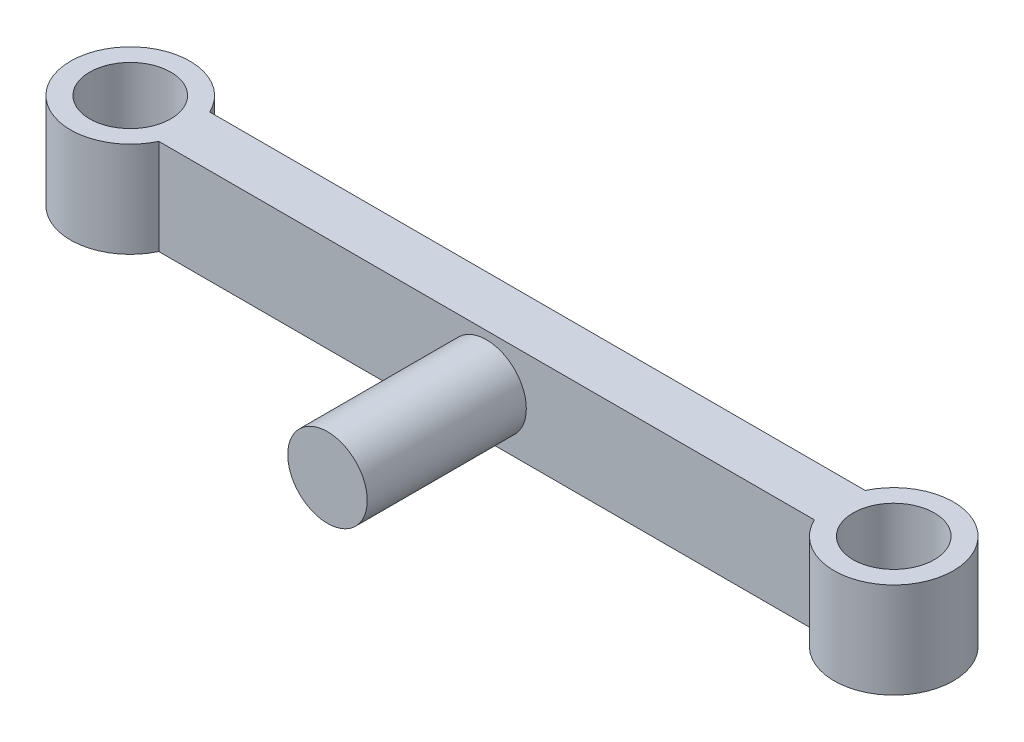
ISO-10303-21;
HEADER;
FILE_DESCRIPTION(('STEP AP214'),'2;1');
FILE_NAME('part.step','',(''),(''),'','','');
FILE_SCHEMA(('AUTOMOTIVE_DESIGN { 1 0 10303 214 1 1 1 1 }'));
ENDSEC;
DATA;
#1=APPLICATION_CONTEXT('core data for automotive mechanical design processes');
#2=APPLICATION_PROTOCOL_DEFINITION('international standard','automotive_design',2000,#1);
#3=PRODUCT_CONTEXT('',#1,'mechanical');
#4=PRODUCT('Part','Part','',(#3));
#5=PRODUCT_RELATED_PRODUCT_CATEGORY('part','',(#4));
#6=PRODUCT_DEFINITION_FORMATION('','',#4);
#7=PRODUCT_DEFINITION_CONTEXT('part definition',#1,'design');
#8=PRODUCT_DEFINITION('design','',#6,#7);
#9=PRODUCT_DEFINITION_SHAPE('','',#8);
#10=(LENGTH_UNIT() NAMED_UNIT(*) SI_UNIT(.MILLI.,.METRE.));
#11=(NAMED_UNIT(*) PLANE_ANGLE_UNIT() SI_UNIT($,.RADIAN.));
#12=(NAMED_UNIT(*) SI_UNIT($,.STERADIAN.) SOLID_ANGLE_UNIT());
#13=UNCERTAINTY_MEASURE_WITH_UNIT(LENGTH_MEASURE(1.E-05),#10,'distance_accuracy_value','');
#14=(GEOMETRIC_REPRESENTATION_CONTEXT(3) GLOBAL_UNCERTAINTY_ASSIGNED_CONTEXT((#13)) GLOBAL_UNIT_ASSIGNED_CONTEXT((#10,
#11,#12)) REPRESENTATION_CONTEXT('',''));
#15=CARTESIAN_POINT('',(0.,0.,0.));
#16=DIRECTION('',(0.,0.,1.));
#17=DIRECTION('',(1.,0.,0.));
#18=AXIS2_PLACEMENT_3D('',#15,#16,#17);
#19=CARTESIAN_POINT('',(0.,0.,29.));
#20=DIRECTION('',(0.,0.,-1.));
#21=DIRECTION('',(-1.,0.,0.));
#22=AXIS2_PLACEMENT_3D('',#19,#20,#21);
#23=CYLINDRICAL_SURFACE('',#22,6.25);
#24=CARTESIAN_POINT('',(0.,0.,4.));
#25=DIRECTION('',(0.,0.,1.));
#26=DIRECTION('',(1.,0.,0.));
#27=AXIS2_PLACEMENT_3D('',#24,#25,#26);
#28=CIRCLE('',#27,6.25);
#29=CARTESIAN_POINT('',(6.25,0.,4.));
#30=VERTEX_POINT('',#29);
#31=EDGE_CURVE('E89',#30,#30,#28,.T.);
#32=ORIENTED_EDGE('',*,*,#31,.T.);
#33=EDGE_LOOP('',(#32));
#34=FACE_BOUND('',#33,.T.);
#35=CARTESIAN_POINT('',(0.,0.,29.));
#36=DIRECTION('',(0.,0.,1.));
#37=DIRECTION('',(1.,0.,0.));
#38=AXIS2_PLACEMENT_3D('',#35,#36,#37);
#39=CIRCLE('',#38,6.25);
#40=CARTESIAN_POINT('',(6.25,0.,29.));
#41=VERTEX_POINT('',#40);
#42=EDGE_CURVE('E107',#41,#41,#39,.T.);
#43=ORIENTED_EDGE('',*,*,#42,.F.);
#44=EDGE_LOOP('',(#43));
#45=FACE_BOUND('',#44,.T.);
#46=DIRECTION('',(0.,0.,-1.));
#47=VECTOR('',#46,1.);
#48=CARTESIAN_POINT('',(-4.33733789322437,-4.5,29.));
#49=LINE('',#48,#47);
#50=CARTESIAN_POINT('',(-4.33733789322437,-4.5,26.));
#51=VERTEX_POINT('',#50);
#52=CARTESIAN_POINT('',(-4.33733789322437,-4.5,18.));
#53=VERTEX_POINT('',#52);
#54=EDGE_CURVE('E94',#51,#53,#49,.T.);
#55=ORIENTED_EDGE('',*,*,#54,.F.);
#56=CARTESIAN_POINT('',(0.,0.,26.));
#57=DIRECTION('',(0.,0.,-1.));
#58=DIRECTION('',(0.,1.,0.));
#59=AXIS2_PLACEMENT_3D('',#56,#57,#58);
#60=CIRCLE('',#59,6.25);
#61=CARTESIAN_POINT('',(4.33733789322437,-4.5,26.));
#62=VERTEX_POINT('',#61);
#63=EDGE_CURVE('E101',#51,#62,#60,.F.);
#64=ORIENTED_EDGE('',*,*,#63,.T.);
#65=DIRECTION('',(0.,0.,-1.));
#66=VECTOR('',#65,1.);
#67=CARTESIAN_POINT('',(4.33733789322437,-4.5,29.));
#68=LINE('',#67,#66);
#69=CARTESIAN_POINT('',(4.33733789322437,-4.5,18.));
#70=VERTEX_POINT('',#69);
#71=EDGE_CURVE('E100',#62,#70,#68,.T.);
#72=ORIENTED_EDGE('',*,*,#71,.T.);
#73=CARTESIAN_POINT('',(0.,0.,18.));
#74=DIRECTION('',(0.,0.,1.));
#75=DIRECTION('',(0.,-1.,0.));
#76=AXIS2_PLACEMENT_3D('',#73,#74,#75);
#77=CIRCLE('',#76,6.25);
#78=EDGE_CURVE('E87',#70,#53,#77,.F.);
#79=ORIENTED_EDGE('',*,*,#78,.T.);
#80=EDGE_LOOP('',(#55,#64,#72,#79));
#81=FACE_BOUND('',#80,.T.);
#82=ADVANCED_FACE('F33',(#34,#45,#81),#23,.T.);
#83=CARTESIAN_POINT('',(-60.,7.5,0.));
#84=DIRECTION('',(0.,-1.,0.));
#85=DIRECTION('',(0.,0.,-1.));
#86=AXIS2_PLACEMENT_3D('',#83,#84,#85);
#87=PLANE('',#86);
#88=CARTESIAN_POINT('',(-60.,7.5,0.));
#89=DIRECTION('',(0.,1.,0.));
#90=DIRECTION('',(0.,0.,-1.));
#91=AXIS2_PLACEMENT_3D('',#88,#89,#90);
#92=CIRCLE('',#91,9.375);
#93=CARTESIAN_POINT('',(-51.5211660589442,7.5,-4.));
#94=VERTEX_POINT('',#93);
#95=CARTESIAN_POINT('',(-51.5211660589442,7.5,4.));
#96=VERTEX_POINT('',#95);
#97=EDGE_CURVE('E11',#94,#96,#92,.T.);
#98=ORIENTED_EDGE('',*,*,#97,.T.);
#99=DIRECTION('',(1.,0.,0.));
#100=VECTOR('',#99,1.);
#101=CARTESIAN_POINT('',(-500000.,7.5,4.));
#102=LINE('',#101,#100);
#103=CARTESIAN_POINT('',(51.5211660589442,7.5,4.));
#104=VERTEX_POINT('',#103);
#105=EDGE_CURVE('E132',#96,#104,#102,.T.);
#106=ORIENTED_EDGE('',*,*,#105,.T.);
#107=CARTESIAN_POINT('',(60.,7.5,0.));
#108=DIRECTION('',(0.,1.,0.));
#109=DIRECTION('',(0.,0.,1.));
#110=AXIS2_PLACEMENT_3D('',#107,#108,#109);
#111=CIRCLE('',#110,9.375);
#112=CARTESIAN_POINT('',(51.5211660589535,7.5,-4.00000000001977));
#113=VERTEX_POINT('',#112);
#114=EDGE_CURVE('E119',#104,#113,#111,.T.);
#115=ORIENTED_EDGE('',*,*,#114,.T.);
#116=DIRECTION('',(1.,0.,0.));
#117=VECTOR('',#116,1.);
#118=CARTESIAN_POINT('',(-500000.,7.5,-4.));
#119=LINE('',#118,#117);
#120=EDGE_CURVE('E55',#94,#113,#119,.T.);
#121=ORIENTED_EDGE('',*,*,#120,.F.);
#122=EDGE_LOOP('',(#98,#106,#115,#121));
#123=FACE_BOUND('',#122,.T.);
#124=CARTESIAN_POINT('',(-60.,7.5,0.));
#125=DIRECTION('',(0.,1.,0.));
#126=DIRECTION('',(0.,0.,-1.));
#127=AXIS2_PLACEMENT_3D('',#124,#125,#126);
#128=CIRCLE('',#127,6.375);
#129=CARTESIAN_POINT('',(-60.,7.5,-6.375));
#130=VERTEX_POINT('',#129);
#131=EDGE_CURVE('E142',#130,#130,#128,.T.);
#132=ORIENTED_EDGE('',*,*,#131,.F.);
#133=EDGE_LOOP('',(#132));
#134=FACE_BOUND('',#133,.T.);
#135=CARTESIAN_POINT('',(60.,7.5,0.));
#136=DIRECTION('',(0.,1.,0.));
#137=DIRECTION('',(0.,0.,1.));
#138=AXIS2_PLACEMENT_3D('',#135,#136,#137);
#139=CIRCLE('',#138,6.37500000000001);
#140=CARTESIAN_POINT('',(60.,7.5,6.37500000000001));
#141=VERTEX_POINT('',#140);
#142=EDGE_CURVE('E113',#141,#141,#139,.T.);
#143=ORIENTED_EDGE('',*,*,#142,.F.);
#144=EDGE_LOOP('',(#143));
#145=FACE_BOUND('',#144,.T.);
#146=ADVANCED_FACE('F170',(#123,#134,#145),#87,.F.);
#147=CARTESIAN_POINT('',(-60.,-7.5,0.));
#148=DIRECTION('',(0.,-1.,0.));
#149=DIRECTION('',(0.,0.,-1.));
#150=AXIS2_PLACEMENT_3D('',#147,#148,#149);
#151=PLANE('',#150);
#152=CARTESIAN_POINT('',(-60.,-7.5,0.));
#153=DIRECTION('',(0.,1.,0.));
#154=DIRECTION('',(0.,0.,-1.));
#155=AXIS2_PLACEMENT_3D('',#152,#153,#154);
#156=CIRCLE('',#155,9.375);
#157=CARTESIAN_POINT('',(-51.5211660590467,-7.5,-4.));
#158=VERTEX_POINT('',#157);
#159=CARTESIAN_POINT('',(-51.5211660589442,-7.5,3.99999999999999));
#160=VERTEX_POINT('',#159);
#161=EDGE_CURVE('E37',#158,#160,#156,.T.);
#162=ORIENTED_EDGE('',*,*,#161,.F.);
#163=DIRECTION('',(1.,0.,0.));
#164=VECTOR('',#163,1.);
#165=CARTESIAN_POINT('',(-500000.,-7.5,-4.));
#166=LINE('',#165,#164);
#167=CARTESIAN_POINT('',(51.5211660589628,-7.5,-4.00000000003955));
#168=VERTEX_POINT('',#167);
#169=EDGE_CURVE('E137',#158,#168,#166,.T.);
#170=ORIENTED_EDGE('',*,*,#169,.T.);
#171=CARTESIAN_POINT('',(60.,-7.5,0.));
#172=DIRECTION('',(0.,1.,0.));
#173=DIRECTION('',(0.,0.,1.));
#174=AXIS2_PLACEMENT_3D('',#171,#172,#173);
#175=CIRCLE('',#174,9.375);
#176=CARTESIAN_POINT('',(51.5211660589442,-7.5,3.99999999999999));
#177=VERTEX_POINT('',#176);
#178=EDGE_CURVE('E116',#177,#168,#175,.T.);
#179=ORIENTED_EDGE('',*,*,#178,.F.);
#180=DIRECTION('',(1.,0.,0.));
#181=VECTOR('',#180,1.);
#182=CARTESIAN_POINT('',(-500000.,-7.5,4.));
#183=LINE('',#182,#181);
#184=EDGE_CURVE('E130',#160,#177,#183,.T.);
#185=ORIENTED_EDGE('',*,*,#184,.F.);
#186=EDGE_LOOP('',(#162,#170,#179,#185));
#187=FACE_BOUND('',#186,.T.);
#188=CARTESIAN_POINT('',(-60.,-7.5,0.));
#189=DIRECTION('',(0.,1.,0.));
#190=DIRECTION('',(0.,0.,-1.));
#191=AXIS2_PLACEMENT_3D('',#188,#189,#190);
#192=CIRCLE('',#191,6.375);
#193=CARTESIAN_POINT('',(-60.,-7.5,-6.375));
#194=VERTEX_POINT('',#193);
#195=EDGE_CURVE('E135',#194,#194,#192,.T.);
#196=ORIENTED_EDGE('',*,*,#195,.T.);
#197=EDGE_LOOP('',(#196));
#198=FACE_BOUND('',#197,.T.);
#199=CARTESIAN_POINT('',(60.,-7.5,0.));
#200=DIRECTION('',(0.,1.,0.));
#201=DIRECTION('',(0.,0.,1.));
#202=AXIS2_PLACEMENT_3D('',#199,#200,#201);
#203=CIRCLE('',#202,6.37500000000001);
#204=CARTESIAN_POINT('',(60.,-7.5,6.37500000000001));
#205=VERTEX_POINT('',#204);
#206=EDGE_CURVE('E110',#205,#205,#203,.T.);
#207=ORIENTED_EDGE('',*,*,#206,.T.);
#208=EDGE_LOOP('',(#207));
#209=FACE_BOUND('',#208,.T.);
#210=ADVANCED_FACE('F148',(#187,#198,#209),#151,.T.);
#211=CARTESIAN_POINT('',(-60.,7.5,0.));
#212=DIRECTION('',(0.,-1.,0.));
#213=DIRECTION('',(0.,0.,-1.));
#214=AXIS2_PLACEMENT_3D('',#211,#212,#213);
#215=CYLINDRICAL_SURFACE('',#214,9.375);
#216=ORIENTED_EDGE('',*,*,#161,.T.);
#217=DIRECTION('',(0.,-1.,0.));
#218=VECTOR('',#217,1.);
#219=CARTESIAN_POINT('',(-51.5211660589442,7.5,4.));
#220=LINE('',#219,#218);
#221=EDGE_CURVE('E126',#96,#160,#220,.T.);
#222=ORIENTED_EDGE('',*,*,#221,.F.);
#223=ORIENTED_EDGE('',*,*,#97,.F.);
#224=DIRECTION('',(0.,-1.,0.));
#225=VECTOR('',#224,1.);
#226=CARTESIAN_POINT('',(-51.5211660589442,7.5,-4.));
#227=LINE('',#226,#225);
#228=EDGE_CURVE('E128',#158,#94,#227,.F.);
#229=ORIENTED_EDGE('',*,*,#228,.F.);
#230=EDGE_LOOP('',(#216,#222,#223,#229));
#231=FACE_BOUND('',#230,.T.);
#232=ADVANCED_FACE('F35',(#231),#215,.T.);
#233=CARTESIAN_POINT('',(-60.,7.5,0.));
#234=DIRECTION('',(0.,-1.,0.));
#235=DIRECTION('',(0.,0.,-1.));
#236=AXIS2_PLACEMENT_3D('',#233,#234,#235);
#237=CYLINDRICAL_SURFACE('',#236,6.375);
#238=ORIENTED_EDGE('',*,*,#131,.T.);
#239=EDGE_LOOP('',(#238));
#240=FACE_BOUND('',#239,.T.);
#241=ORIENTED_EDGE('',*,*,#195,.F.);
#242=EDGE_LOOP('',(#241));
#243=FACE_BOUND('',#242,.T.);
#244=ADVANCED_FACE('F151',(#240,#243),#237,.F.);
#245=CARTESIAN_POINT('',(-500000.,7.5,4.));
#246=DIRECTION('',(0.,0.,1.));
#247=DIRECTION('',(0.,-1.,0.));
#248=AXIS2_PLACEMENT_3D('',#245,#246,#247);
#249=PLANE('',#248);
#250=ORIENTED_EDGE('',*,*,#31,.F.);
#251=EDGE_LOOP('',(#250));
#252=FACE_BOUND('',#251,.T.);
#253=ORIENTED_EDGE('',*,*,#105,.F.);
#254=ORIENTED_EDGE('',*,*,#221,.T.);
#255=ORIENTED_EDGE('',*,*,#184,.T.);
#256=DIRECTION('',(0.,-1.,0.));
#257=VECTOR('',#256,1.);
#258=CARTESIAN_POINT('',(51.5211660589442,7.5,4.));
#259=LINE('',#258,#257);
#260=EDGE_CURVE('E123',#104,#177,#259,.T.);
#261=ORIENTED_EDGE('',*,*,#260,.F.);
#262=EDGE_LOOP('',(#253,#254,#255,#261));
#263=FACE_BOUND('',#262,.T.);
#264=ADVANCED_FACE('F153',(#252,#263),#249,.T.);
#265=CARTESIAN_POINT('',(-500000.,7.5,-4.));
#266=DIRECTION('',(0.,0.,-1.));
#267=DIRECTION('',(-1.,0.,0.));
#268=AXIS2_PLACEMENT_3D('',#265,#266,#267);
#269=PLANE('',#268);
#270=ORIENTED_EDGE('',*,*,#169,.F.);
#271=ORIENTED_EDGE('',*,*,#228,.T.);
#272=ORIENTED_EDGE('',*,*,#120,.T.);
#273=DIRECTION('',(0.,-1.,0.));
#274=VECTOR('',#273,1.);
#275=CARTESIAN_POINT('',(51.5211660589442,7.5,-4.));
#276=LINE('',#275,#274);
#277=EDGE_CURVE('E121',#168,#113,#276,.F.);
#278=ORIENTED_EDGE('',*,*,#277,.F.);
#279=EDGE_LOOP('',(#270,#271,#272,#278));
#280=FACE_BOUND('',#279,.T.);
#281=ADVANCED_FACE('F156',(#280),#269,.T.);
#282=CARTESIAN_POINT('',(60.,7.5,0.));
#283=DIRECTION('',(0.,-1.,0.));
#284=DIRECTION('',(0.,0.,-1.));
#285=AXIS2_PLACEMENT_3D('',#282,#283,#284);
#286=CYLINDRICAL_SURFACE('',#285,9.375);
#287=ORIENTED_EDGE('',*,*,#260,.T.);
#288=ORIENTED_EDGE('',*,*,#178,.T.);
#289=ORIENTED_EDGE('',*,*,#277,.T.);
#290=ORIENTED_EDGE('',*,*,#114,.F.);
#291=EDGE_LOOP('',(#287,#288,#289,#290));
#292=FACE_BOUND('',#291,.T.);
#293=ADVANCED_FACE('F163',(#292),#286,.T.);
#294=CARTESIAN_POINT('',(60.,7.5,0.));
#295=DIRECTION('',(0.,-1.,0.));
#296=DIRECTION('',(0.,0.,-1.));
#297=AXIS2_PLACEMENT_3D('',#294,#295,#296);
#298=CYLINDRICAL_SURFACE('',#297,6.37500000000001);
#299=ORIENTED_EDGE('',*,*,#142,.T.);
#300=EDGE_LOOP('',(#299));
#301=FACE_BOUND('',#300,.T.);
#302=ORIENTED_EDGE('',*,*,#206,.F.);
#303=EDGE_LOOP('',(#302));
#304=FACE_BOUND('',#303,.T.);
#305=ADVANCED_FACE('F181',(#301,#304),#298,.F.);
#306=CARTESIAN_POINT('',(0.,0.,29.));
#307=DIRECTION('',(0.,0.,1.));
#308=DIRECTION('',(1.,0.,0.));
#309=AXIS2_PLACEMENT_3D('',#306,#307,#308);
#310=PLANE('',#309);
#311=ORIENTED_EDGE('',*,*,#42,.T.);
#312=EDGE_LOOP('',(#311));
#313=FACE_BOUND('',#312,.T.);
#314=ADVANCED_FACE('F179',(#313),#310,.T.);
#315=CARTESIAN_POINT('',(69.376,-4.5,26.));
#316=DIRECTION('',(0.,0.,-1.));
#317=DIRECTION('',(0.,1.,0.));
#318=AXIS2_PLACEMENT_3D('',#315,#316,#317);
#319=PLANE('',#318);
#320=DIRECTION('',(-1.,0.,0.));
#321=VECTOR('',#320,1.);
#322=CARTESIAN_POINT('',(69.376,-4.5,26.));
#323=LINE('',#322,#321);
#324=EDGE_CURVE('E90',#62,#51,#323,.T.);
#325=ORIENTED_EDGE('',*,*,#324,.F.);
#326=ORIENTED_EDGE('',*,*,#63,.F.);
#327=EDGE_LOOP('',(#325,#326));
#328=FACE_BOUND('',#327,.T.);
#329=ADVANCED_FACE('F247',(#328),#319,.T.);
#330=CARTESIAN_POINT('',(69.376,-4.5,18.));
#331=DIRECTION('',(0.,0.,1.));
#332=DIRECTION('',(0.,-1.,0.));
#333=AXIS2_PLACEMENT_3D('',#330,#331,#332);
#334=PLANE('',#333);
#335=DIRECTION('',(-1.,0.,0.));
#336=VECTOR('',#335,1.);
#337=CARTESIAN_POINT('',(69.376,-4.5,18.));
#338=LINE('',#337,#336);
#339=EDGE_CURVE('E48',#70,#53,#338,.T.);
#340=ORIENTED_EDGE('',*,*,#339,.T.);
#341=ORIENTED_EDGE('',*,*,#78,.F.);
#342=EDGE_LOOP('',(#340,#341));
#343=FACE_BOUND('',#342,.T.);
#344=ADVANCED_FACE('F85',(#343),#334,.T.);
#345=CARTESIAN_POINT('',(69.376,-4.5,26.));
#346=DIRECTION('',(0.,-1.,0.));
#347=DIRECTION('',(0.,0.,-1.));
#348=AXIS2_PLACEMENT_3D('',#345,#346,#347);
#349=PLANE('',#348);
#350=ORIENTED_EDGE('',*,*,#324,.T.);
#351=ORIENTED_EDGE('',*,*,#54,.T.);
#352=ORIENTED_EDGE('',*,*,#339,.F.);
#353=ORIENTED_EDGE('',*,*,#71,.F.);
#354=EDGE_LOOP('',(#350,#351,#352,#353));
#355=FACE_BOUND('',#354,.T.);
#356=ADVANCED_FACE('F95',(#355),#349,.T.);
#357=CLOSED_SHELL('',(#82,#146,#210,#232,#244,#264,#281,#293,#305,#314,#329,#344,#356));
#358=MANIFOLD_SOLID_BREP('B2',#357);
#359=ADVANCED_BREP_SHAPE_REPRESENTATION('',(#18,#358),#14);
#360=SHAPE_DEFINITION_REPRESENTATION(#9,#359);
ENDSEC;
END-ISO-10303-21;
